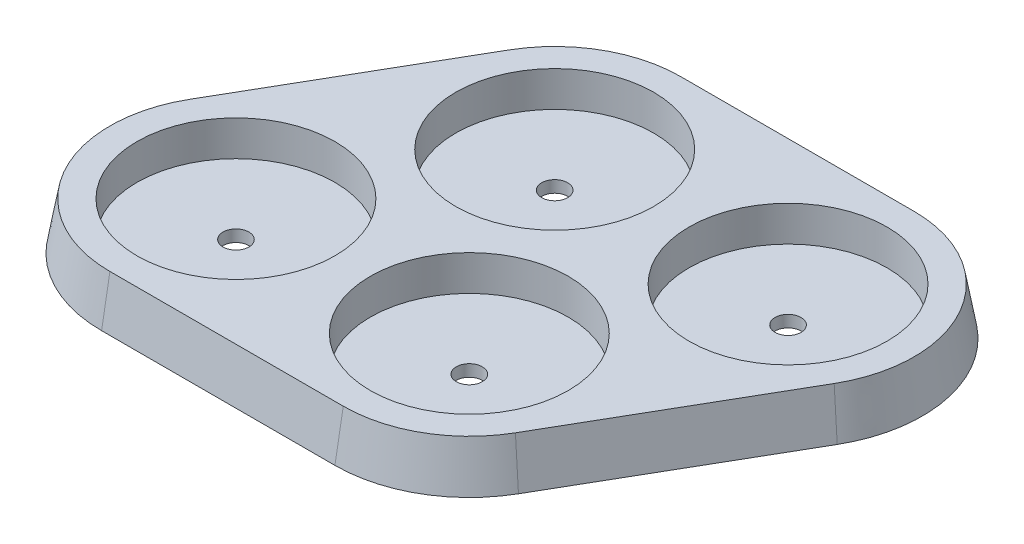
ISO-10303-21;
HEADER;
FILE_DESCRIPTION(('STEP AP214'),'2;1');
FILE_NAME('part.step','',(''),(''),'','','');
FILE_SCHEMA(('AUTOMOTIVE_DESIGN { 1 0 10303 214 1 1 1 1 }'));
ENDSEC;
DATA;
#1=APPLICATION_CONTEXT('core data for automotive mechanical design processes');
#2=APPLICATION_PROTOCOL_DEFINITION('international standard','automotive_design',2000,#1);
#3=PRODUCT_CONTEXT('',#1,'mechanical');
#4=PRODUCT('Part','Part','',(#3));
#5=PRODUCT_RELATED_PRODUCT_CATEGORY('part','',(#4));
#6=PRODUCT_DEFINITION_FORMATION('','',#4);
#7=PRODUCT_DEFINITION_CONTEXT('part definition',#1,'design');
#8=PRODUCT_DEFINITION('design','',#6,#7);
#9=PRODUCT_DEFINITION_SHAPE('','',#8);
#10=(LENGTH_UNIT() NAMED_UNIT(*) SI_UNIT(.MILLI.,.METRE.));
#11=(NAMED_UNIT(*) PLANE_ANGLE_UNIT() SI_UNIT($,.RADIAN.));
#12=(NAMED_UNIT(*) SI_UNIT($,.STERADIAN.) SOLID_ANGLE_UNIT());
#13=UNCERTAINTY_MEASURE_WITH_UNIT(LENGTH_MEASURE(1.E-05),#10,'distance_accuracy_value','');
#14=(GEOMETRIC_REPRESENTATION_CONTEXT(3) GLOBAL_UNCERTAINTY_ASSIGNED_CONTEXT((#13)) GLOBAL_UNIT_ASSIGNED_CONTEXT((#10,
#11,#12)) REPRESENTATION_CONTEXT('',''));
#15=CARTESIAN_POINT('',(0.,0.,0.));
#16=DIRECTION('',(0.,0.,1.));
#17=DIRECTION('',(1.,0.,0.));
#18=AXIS2_PLACEMENT_3D('',#15,#16,#17);
#19=CARTESIAN_POINT('',(-9.90000000000008,0.,17.1473029949318));
#20=DIRECTION('',(0.,1.,0.));
#21=DIRECTION('',(0.,0.,1.));
#22=AXIS2_PLACEMENT_3D('',#19,#20,#21);
#23=CYLINDRICAL_SURFACE('',#22,1.1);
#24=CARTESIAN_POINT('',(-9.90000000000008,0.,17.1473029949318));
#25=DIRECTION('',(0.,1.,0.));
#26=DIRECTION('',(0.,0.,1.));
#27=AXIS2_PLACEMENT_3D('',#24,#25,#26);
#28=CIRCLE('',#27,1.1);
#29=CARTESIAN_POINT('',(-9.90000000000008,0.,18.2473029949318));
#30=VERTEX_POINT('',#29);
#31=EDGE_CURVE('E154',#30,#30,#28,.T.);
#32=ORIENTED_EDGE('',*,*,#31,.F.);
#33=EDGE_LOOP('',(#32));
#34=FACE_BOUND('',#33,.T.);
#35=CARTESIAN_POINT('',(-9.90000000000008,1.,17.1473029949318));
#36=DIRECTION('',(0.,1.,0.));
#37=DIRECTION('',(0.,0.,1.));
#38=AXIS2_PLACEMENT_3D('',#35,#36,#37);
#39=CIRCLE('',#38,1.1);
#40=CARTESIAN_POINT('',(-9.90000000000008,1.,18.2473029949318));
#41=VERTEX_POINT('',#40);
#42=EDGE_CURVE('E510',#41,#41,#39,.T.);
#43=ORIENTED_EDGE('',*,*,#42,.T.);
#44=EDGE_LOOP('',(#43));
#45=FACE_BOUND('',#44,.T.);
#46=ADVANCED_FACE('F65',(#34,#45),#23,.F.);
#47=CARTESIAN_POINT('',(-19.7999999999998,0.,0.));
#48=DIRECTION('',(0.,1.,0.));
#49=DIRECTION('',(0.,0.,1.));
#50=AXIS2_PLACEMENT_3D('',#47,#48,#49);
#51=CYLINDRICAL_SURFACE('',#50,1.10000000000001);
#52=CARTESIAN_POINT('',(-19.7999999999998,0.,0.));
#53=DIRECTION('',(0.,1.,0.));
#54=DIRECTION('',(0.,0.,1.));
#55=AXIS2_PLACEMENT_3D('',#52,#53,#54);
#56=CIRCLE('',#55,1.10000000000001);
#57=CARTESIAN_POINT('',(-19.7999999999998,0.,1.10000000000001));
#58=VERTEX_POINT('',#57);
#59=EDGE_CURVE('E529',#58,#58,#56,.T.);
#60=ORIENTED_EDGE('',*,*,#59,.F.);
#61=EDGE_LOOP('',(#60));
#62=FACE_BOUND('',#61,.T.);
#63=CARTESIAN_POINT('',(-19.7999999999998,1.,0.));
#64=DIRECTION('',(0.,1.,0.));
#65=DIRECTION('',(0.,0.,1.));
#66=AXIS2_PLACEMENT_3D('',#63,#64,#65);
#67=CIRCLE('',#66,1.10000000000001);
#68=CARTESIAN_POINT('',(-19.7999999999998,1.,1.10000000000001));
#69=VERTEX_POINT('',#68);
#70=EDGE_CURVE('E519',#69,#69,#67,.T.);
#71=ORIENTED_EDGE('',*,*,#70,.T.);
#72=EDGE_LOOP('',(#71));
#73=FACE_BOUND('',#72,.T.);
#74=ADVANCED_FACE('F252',(#62,#73),#51,.F.);
#75=CARTESIAN_POINT('',(-29.6999999999999,0.,17.1473029949318));
#76=DIRECTION('',(0.,1.,0.));
#77=DIRECTION('',(0.,0.,1.));
#78=AXIS2_PLACEMENT_3D('',#75,#76,#77);
#79=CYLINDRICAL_SURFACE('',#78,1.1);
#80=CARTESIAN_POINT('',(-29.6999999999999,0.,17.1473029949318));
#81=DIRECTION('',(0.,1.,0.));
#82=DIRECTION('',(0.,0.,1.));
#83=AXIS2_PLACEMENT_3D('',#80,#81,#82);
#84=CIRCLE('',#83,1.1);
#85=CARTESIAN_POINT('',(-29.6999999999999,0.,18.2473029949319));
#86=VERTEX_POINT('',#85);
#87=EDGE_CURVE('E536',#86,#86,#84,.T.);
#88=ORIENTED_EDGE('',*,*,#87,.F.);
#89=EDGE_LOOP('',(#88));
#90=FACE_BOUND('',#89,.T.);
#91=CARTESIAN_POINT('',(-29.6999999999999,1.,17.1473029949318));
#92=DIRECTION('',(0.,1.,0.));
#93=DIRECTION('',(0.,0.,1.));
#94=AXIS2_PLACEMENT_3D('',#91,#92,#93);
#95=CIRCLE('',#94,1.1);
#96=CARTESIAN_POINT('',(-29.6999999999999,1.,18.2473029949319));
#97=VERTEX_POINT('',#96);
#98=EDGE_CURVE('E512',#97,#97,#95,.T.);
#99=ORIENTED_EDGE('',*,*,#98,.T.);
#100=EDGE_LOOP('',(#99));
#101=FACE_BOUND('',#100,.T.);
#102=ADVANCED_FACE('F258',(#90,#101),#79,.F.);
#103=CARTESIAN_POINT('',(0.,0.,0.));
#104=DIRECTION('',(0.,1.,0.));
#105=DIRECTION('',(0.,0.,1.));
#106=AXIS2_PLACEMENT_3D('',#103,#104,#105);
#107=CYLINDRICAL_SURFACE('',#106,1.1);
#108=CARTESIAN_POINT('',(0.,0.,0.));
#109=DIRECTION('',(0.,1.,0.));
#110=DIRECTION('',(0.,0.,1.));
#111=AXIS2_PLACEMENT_3D('',#108,#109,#110);
#112=CIRCLE('',#111,1.1);
#113=CARTESIAN_POINT('',(0.,0.,1.1));
#114=VERTEX_POINT('',#113);
#115=EDGE_CURVE('E158',#114,#114,#112,.T.);
#116=ORIENTED_EDGE('',*,*,#115,.F.);
#117=EDGE_LOOP('',(#116));
#118=FACE_BOUND('',#117,.T.);
#119=CARTESIAN_POINT('',(0.,1.,0.));
#120=DIRECTION('',(0.,1.,0.));
#121=DIRECTION('',(0.,0.,1.));
#122=AXIS2_PLACEMENT_3D('',#119,#120,#121);
#123=CIRCLE('',#122,1.1);
#124=CARTESIAN_POINT('',(0.,1.,1.1));
#125=VERTEX_POINT('',#124);
#126=EDGE_CURVE('E491',#125,#125,#123,.T.);
#127=ORIENTED_EDGE('',*,*,#126,.T.);
#128=EDGE_LOOP('',(#127));
#129=FACE_BOUND('',#128,.T.);
#130=ADVANCED_FACE('F275',(#118,#129),#107,.F.);
#131=CARTESIAN_POINT('',(9.87268960314258,0.,5.70000000000005));
#132=DIRECTION('',(0.852868531952441,0.173648177666931,0.492403876506108));
#133=DIRECTION('',(0.500000000000004,0.,-0.866025403784436));
#134=AXIS2_PLACEMENT_3D('',#131,#132,#133);
#135=PLANE('',#134);
#136=DIRECTION('',(-0.500000000000004,0.,0.866025403784436));
#137=VECTOR('',#136,1.);
#138=CARTESIAN_POINT('',(9.87268960314258,0.,5.70000000000005));
#139=LINE('',#138,#137);
#140=CARTESIAN_POINT('',(9.87268960314258,0.,5.70000000000005));
#141=VERTEX_POINT('',#140);
#142=CARTESIAN_POINT('',(-0.0273103968575087,0.,22.8473029949319));
#143=VERTEX_POINT('',#142);
#144=EDGE_CURVE('E145',#141,#143,#139,.T.);
#145=ORIENTED_EDGE('',*,*,#144,.F.);
#146=DIRECTION('',(0.150383733180435,-0.984807753012208,0.0868240888334661));
#147=VECTOR('',#146,1.);
#148=CARTESIAN_POINT('',(9.87268960314258,0.,5.70000000000004));
#149=LINE('',#148,#147);
#150=CARTESIAN_POINT('',(9.26187502447802,4.,5.34734603858311));
#151=VERTEX_POINT('',#150);
#152=EDGE_CURVE('E12',#151,#141,#149,.T.);
#153=ORIENTED_EDGE('',*,*,#152,.F.);
#154=DIRECTION('',(-0.500000000000004,0.,0.866025403784436));
#155=VECTOR('',#154,1.);
#156=CARTESIAN_POINT('',(9.26187502447802,4.,5.34734603858312));
#157=LINE('',#156,#155);
#158=CARTESIAN_POINT('',(-0.638124975522065,4.,22.494649033515));
#159=VERTEX_POINT('',#158);
#160=EDGE_CURVE('E182',#151,#159,#157,.T.);
#161=ORIENTED_EDGE('',*,*,#160,.T.);
#162=DIRECTION('',(0.150383733180435,-0.984807753012208,0.0868240888334661));
#163=VECTOR('',#162,1.);
#164=CARTESIAN_POINT('',(-0.0273103968575079,0.,22.8473029949319));
#165=LINE('',#164,#163);
#166=EDGE_CURVE('E151',#159,#143,#165,.T.);
#167=ORIENTED_EDGE('',*,*,#166,.T.);
#168=EDGE_LOOP('',(#145,#153,#161,#167));
#169=FACE_BOUND('',#168,.T.);
#170=ADVANCED_FACE('F150',(#169),#135,.T.);
#171=CARTESIAN_POINT('',(0.,0.,0.));
#172=DIRECTION('',(0.,-1.,0.));
#173=DIRECTION('',(0.,0.,1.));
#174=AXIS2_PLACEMENT_3D('',#171,#172,#173);
#175=CONICAL_SURFACE('',#174,11.4,0.174532925199433);
#176=CARTESIAN_POINT('',(0.,0.,0.));
#177=DIRECTION('',(0.,1.,0.));
#178=DIRECTION('',(0.,0.,1.));
#179=AXIS2_PLACEMENT_3D('',#176,#177,#178);
#180=CIRCLE('',#179,11.4);
#181=CARTESIAN_POINT('',(0.,0.,-11.4));
#182=VERTEX_POINT('',#181);
#183=EDGE_CURVE('E134',#141,#182,#180,.T.);
#184=ORIENTED_EDGE('',*,*,#183,.T.);
#185=DIRECTION('',(0.,-0.984807753012208,-0.173648177666931));
#186=VECTOR('',#185,1.);
#187=CARTESIAN_POINT('',(0.,0.,-11.4));
#188=LINE('',#187,#186);
#189=CARTESIAN_POINT('',(0.,4.,-10.6946920771661));
#190=VERTEX_POINT('',#189);
#191=EDGE_CURVE('E75',#190,#182,#188,.T.);
#192=ORIENTED_EDGE('',*,*,#191,.F.);
#193=CARTESIAN_POINT('',(0.,4.,0.));
#194=DIRECTION('',(0.,1.,0.));
#195=DIRECTION('',(0.,0.,1.));
#196=AXIS2_PLACEMENT_3D('',#193,#194,#195);
#197=CIRCLE('',#196,10.6946920771661);
#198=EDGE_CURVE('E136',#151,#190,#197,.T.);
#199=ORIENTED_EDGE('',*,*,#198,.F.);
#200=ORIENTED_EDGE('',*,*,#152,.T.);
#201=EDGE_LOOP('',(#184,#192,#199,#200));
#202=FACE_BOUND('',#201,.T.);
#203=ADVANCED_FACE('F67',(#202),#175,.T.);
#204=CARTESIAN_POINT('',(0.,0.,-11.4));
#205=DIRECTION('',(0.,0.173648177666931,-0.984807753012208));
#206=DIRECTION('',(0.,0.984807753012208,0.173648177666931));
#207=AXIS2_PLACEMENT_3D('',#204,#205,#206);
#208=PLANE('',#207);
#209=DIRECTION('',(-1.,0.,0.));
#210=VECTOR('',#209,1.);
#211=CARTESIAN_POINT('',(0.,0.,-11.4));
#212=LINE('',#211,#210);
#213=CARTESIAN_POINT('',(-19.7999999999998,0.,-11.4));
#214=VERTEX_POINT('',#213);
#215=EDGE_CURVE('E147',#182,#214,#212,.T.);
#216=ORIENTED_EDGE('',*,*,#215,.T.);
#217=DIRECTION('',(0.,-0.984807753012208,-0.173648177666931));
#218=VECTOR('',#217,1.);
#219=CARTESIAN_POINT('',(-19.7999999999998,0.,-11.4));
#220=LINE('',#219,#218);
#221=CARTESIAN_POINT('',(-19.7999999999998,4.,-10.6946920771661));
#222=VERTEX_POINT('',#221);
#223=EDGE_CURVE('E197',#222,#214,#220,.T.);
#224=ORIENTED_EDGE('',*,*,#223,.F.);
#225=DIRECTION('',(1.,0.,0.));
#226=VECTOR('',#225,1.);
#227=CARTESIAN_POINT('',(0.,4.,-10.6946920771661));
#228=LINE('',#227,#226);
#229=EDGE_CURVE('E207',#190,#222,#228,.F.);
#230=ORIENTED_EDGE('',*,*,#229,.F.);
#231=ORIENTED_EDGE('',*,*,#191,.T.);
#232=EDGE_LOOP('',(#216,#224,#230,#231));
#233=FACE_BOUND('',#232,.T.);
#234=ADVANCED_FACE('F236',(#233),#208,.T.);
#235=CARTESIAN_POINT('',(-19.7999999999998,0.,0.));
#236=DIRECTION('',(0.,-1.,0.));
#237=DIRECTION('',(0.,0.,1.));
#238=AXIS2_PLACEMENT_3D('',#235,#236,#237);
#239=CONICAL_SURFACE('',#238,11.4,0.174532925199433);
#240=CARTESIAN_POINT('',(-19.7999999999998,0.,0.));
#241=DIRECTION('',(0.,1.,0.));
#242=DIRECTION('',(0.,0.,1.));
#243=AXIS2_PLACEMENT_3D('',#240,#241,#242);
#244=CIRCLE('',#243,11.4);
#245=CARTESIAN_POINT('',(-29.6726896031424,0.,-5.70000000000005));
#246=VERTEX_POINT('',#245);
#247=EDGE_CURVE('E164',#214,#246,#244,.T.);
#248=ORIENTED_EDGE('',*,*,#247,.T.);
#249=DIRECTION('',(-0.150383733180435,-0.984807753012208,-0.0868240888334661));
#250=VECTOR('',#249,1.);
#251=CARTESIAN_POINT('',(-29.6726896031424,0.,-5.70000000000005));
#252=LINE('',#251,#250);
#253=CARTESIAN_POINT('',(-29.0618750244779,4.,-5.34734603858311));
#254=VERTEX_POINT('',#253);
#255=EDGE_CURVE('E194',#254,#246,#252,.T.);
#256=ORIENTED_EDGE('',*,*,#255,.F.);
#257=CARTESIAN_POINT('',(-19.7999999999998,4.,0.));
#258=DIRECTION('',(0.,1.,0.));
#259=DIRECTION('',(0.,0.,1.));
#260=AXIS2_PLACEMENT_3D('',#257,#258,#259);
#261=CIRCLE('',#260,10.6946920771661);
#262=EDGE_CURVE('E210',#222,#254,#261,.T.);
#263=ORIENTED_EDGE('',*,*,#262,.F.);
#264=ORIENTED_EDGE('',*,*,#223,.T.);
#265=EDGE_LOOP('',(#248,#256,#263,#264));
#266=FACE_BOUND('',#265,.T.);
#267=ADVANCED_FACE('F240',(#266),#239,.T.);
#268=CARTESIAN_POINT('',(-24.7226896031424,0.,-14.273651497466));
#269=DIRECTION('',(-0.852868531952441,0.173648177666931,-0.492403876506108));
#270=DIRECTION('',(-0.500000000000004,0.,0.866025403784436));
#271=AXIS2_PLACEMENT_3D('',#268,#269,#270);
#272=PLANE('',#271);
#273=DIRECTION('',(0.500000000000004,0.,-0.866025403784436));
#274=VECTOR('',#273,1.);
#275=CARTESIAN_POINT('',(-24.7226896031424,0.,-14.273651497466));
#276=LINE('',#275,#274);
#277=CARTESIAN_POINT('',(-39.5726896031425,0.,11.4473029949318));
#278=VERTEX_POINT('',#277);
#279=EDGE_CURVE('E168',#278,#246,#276,.T.);
#280=ORIENTED_EDGE('',*,*,#279,.F.);
#281=DIRECTION('',(-0.150383733180435,-0.984807753012208,-0.0868240888334661));
#282=VECTOR('',#281,1.);
#283=CARTESIAN_POINT('',(-39.5726896031425,0.,11.4473029949318));
#284=LINE('',#283,#282);
#285=CARTESIAN_POINT('',(-38.961875024478,4.,11.7999569563487));
#286=VERTEX_POINT('',#285);
#287=EDGE_CURVE('E191',#286,#278,#284,.T.);
#288=ORIENTED_EDGE('',*,*,#287,.F.);
#289=DIRECTION('',(0.500000000000004,0.,-0.866025403784436));
#290=VECTOR('',#289,1.);
#291=CARTESIAN_POINT('',(-24.1118750244778,4.,-13.920997536049));
#292=LINE('',#291,#290);
#293=EDGE_CURVE('E213',#286,#254,#292,.T.);
#294=ORIENTED_EDGE('',*,*,#293,.T.);
#295=ORIENTED_EDGE('',*,*,#255,.T.);
#296=EDGE_LOOP('',(#280,#288,#294,#295));
#297=FACE_BOUND('',#296,.T.);
#298=ADVANCED_FACE('F242',(#297),#272,.T.);
#299=CARTESIAN_POINT('',(-29.6999999999999,0.,17.1473029949318));
#300=DIRECTION('',(0.,-1.,0.));
#301=DIRECTION('',(0.,0.,1.));
#302=AXIS2_PLACEMENT_3D('',#299,#300,#301);
#303=CONICAL_SURFACE('',#302,11.4,0.174532925199433);
#304=CARTESIAN_POINT('',(-29.6999999999999,0.,17.1473029949318));
#305=DIRECTION('',(0.,1.,0.));
#306=DIRECTION('',(0.,0.,1.));
#307=AXIS2_PLACEMENT_3D('',#304,#305,#306);
#308=CIRCLE('',#307,11.4);
#309=CARTESIAN_POINT('',(-29.6999999999999,0.,28.5473029949318));
#310=VERTEX_POINT('',#309);
#311=EDGE_CURVE('E172',#278,#310,#308,.T.);
#312=ORIENTED_EDGE('',*,*,#311,.T.);
#313=DIRECTION('',(0.,-0.984807753012208,0.173648177666931));
#314=VECTOR('',#313,1.);
#315=CARTESIAN_POINT('',(-29.6999999999999,0.,28.5473029949318));
#316=LINE('',#315,#314);
#317=CARTESIAN_POINT('',(-29.6999999999999,4.,27.841995072098));
#318=VERTEX_POINT('',#317);
#319=EDGE_CURVE('E188',#318,#310,#316,.T.);
#320=ORIENTED_EDGE('',*,*,#319,.F.);
#321=CARTESIAN_POINT('',(-29.6999999999999,4.,17.1473029949318));
#322=DIRECTION('',(0.,1.,0.));
#323=DIRECTION('',(0.,0.,1.));
#324=AXIS2_PLACEMENT_3D('',#321,#322,#323);
#325=CIRCLE('',#324,10.6946920771661);
#326=EDGE_CURVE('E217',#286,#318,#325,.T.);
#327=ORIENTED_EDGE('',*,*,#326,.F.);
#328=ORIENTED_EDGE('',*,*,#287,.T.);
#329=EDGE_LOOP('',(#312,#320,#327,#328));
#330=FACE_BOUND('',#329,.T.);
#331=ADVANCED_FACE('F228',(#330),#303,.T.);
#332=CARTESIAN_POINT('',(0.,0.,28.5473029949318));
#333=DIRECTION('',(0.,0.173648177666931,0.984807753012208));
#334=DIRECTION('',(0.,-0.984807753012208,0.173648177666931));
#335=AXIS2_PLACEMENT_3D('',#332,#333,#334);
#336=PLANE('',#335);
#337=DIRECTION('',(-1.,0.,0.));
#338=VECTOR('',#337,1.);
#339=CARTESIAN_POINT('',(0.,0.,28.5473029949318));
#340=LINE('',#339,#338);
#341=CARTESIAN_POINT('',(-9.90000000000008,0.,28.5473029949318));
#342=VERTEX_POINT('',#341);
#343=EDGE_CURVE('E176',#342,#310,#340,.T.);
#344=ORIENTED_EDGE('',*,*,#343,.F.);
#345=DIRECTION('',(0.,-0.984807753012208,0.173648177666931));
#346=VECTOR('',#345,1.);
#347=CARTESIAN_POINT('',(-9.90000000000008,0.,28.5473029949318));
#348=LINE('',#347,#346);
#349=CARTESIAN_POINT('',(-9.90000000000008,4.,27.841995072098));
#350=VERTEX_POINT('',#349);
#351=EDGE_CURVE('E90',#350,#342,#348,.T.);
#352=ORIENTED_EDGE('',*,*,#351,.F.);
#353=DIRECTION('',(-1.,0.,0.));
#354=VECTOR('',#353,1.);
#355=CARTESIAN_POINT('',(0.,4.,27.841995072098));
#356=LINE('',#355,#354);
#357=EDGE_CURVE('E219',#350,#318,#356,.T.);
#358=ORIENTED_EDGE('',*,*,#357,.T.);
#359=ORIENTED_EDGE('',*,*,#319,.T.);
#360=EDGE_LOOP('',(#344,#352,#358,#359));
#361=FACE_BOUND('',#360,.T.);
#362=ADVANCED_FACE('F222',(#361),#336,.T.);
#363=CARTESIAN_POINT('',(-9.90000000000008,0.,17.1473029949318));
#364=DIRECTION('',(0.,-1.,0.));
#365=DIRECTION('',(0.,0.,1.));
#366=AXIS2_PLACEMENT_3D('',#363,#364,#365);
#367=CONICAL_SURFACE('',#366,11.4,0.174532925199433);
#368=CARTESIAN_POINT('',(-9.90000000000008,0.,17.1473029949318));
#369=DIRECTION('',(0.,1.,0.));
#370=DIRECTION('',(0.,0.,1.));
#371=AXIS2_PLACEMENT_3D('',#368,#369,#370);
#372=CIRCLE('',#371,11.4);
#373=EDGE_CURVE('E180',#342,#143,#372,.T.);
#374=ORIENTED_EDGE('',*,*,#373,.T.);
#375=ORIENTED_EDGE('',*,*,#166,.F.);
#376=CARTESIAN_POINT('',(-9.90000000000008,4.,17.1473029949318));
#377=DIRECTION('',(0.,1.,0.));
#378=DIRECTION('',(0.,0.,1.));
#379=AXIS2_PLACEMENT_3D('',#376,#377,#378);
#380=CIRCLE('',#379,10.6946920771661);
#381=EDGE_CURVE('E69',#350,#159,#380,.T.);
#382=ORIENTED_EDGE('',*,*,#381,.F.);
#383=ORIENTED_EDGE('',*,*,#351,.T.);
#384=EDGE_LOOP('',(#374,#375,#382,#383));
#385=FACE_BOUND('',#384,.T.);
#386=ADVANCED_FACE('F232',(#385),#367,.T.);
#387=CARTESIAN_POINT('',(0.,4.,0.));
#388=DIRECTION('',(0.,1.,0.));
#389=DIRECTION('',(0.,0.,1.));
#390=AXIS2_PLACEMENT_3D('',#387,#388,#389);
#391=PLANE('',#390);
#392=CARTESIAN_POINT('',(-29.6999999999999,4.,17.1473029949318));
#393=DIRECTION('',(0.,1.,0.));
#394=DIRECTION('',(0.,0.,1.));
#395=AXIS2_PLACEMENT_3D('',#392,#393,#394);
#396=CIRCLE('',#395,8.4);
#397=CARTESIAN_POINT('',(-29.6999999999999,4.,25.5473029949319));
#398=VERTEX_POINT('',#397);
#399=EDGE_CURVE('E502',#398,#398,#396,.T.);
#400=ORIENTED_EDGE('',*,*,#399,.F.);
#401=EDGE_LOOP('',(#400));
#402=FACE_BOUND('',#401,.T.);
#403=CARTESIAN_POINT('',(0.,4.,0.));
#404=DIRECTION('',(0.,1.,0.));
#405=DIRECTION('',(0.,0.,1.));
#406=AXIS2_PLACEMENT_3D('',#403,#404,#405);
#407=CIRCLE('',#406,8.4);
#408=CARTESIAN_POINT('',(0.,4.,8.4));
#409=VERTEX_POINT('',#408);
#410=EDGE_CURVE('E493',#409,#409,#407,.T.);
#411=ORIENTED_EDGE('',*,*,#410,.F.);
#412=EDGE_LOOP('',(#411));
#413=FACE_BOUND('',#412,.T.);
#414=CARTESIAN_POINT('',(-9.90000000000008,4.,17.1473029949318));
#415=DIRECTION('',(0.,1.,0.));
#416=DIRECTION('',(0.,0.,1.));
#417=AXIS2_PLACEMENT_3D('',#414,#415,#416);
#418=CIRCLE('',#417,8.4);
#419=CARTESIAN_POINT('',(-9.90000000000008,4.,25.5473029949318));
#420=VERTEX_POINT('',#419);
#421=EDGE_CURVE('E506',#420,#420,#418,.T.);
#422=ORIENTED_EDGE('',*,*,#421,.F.);
#423=EDGE_LOOP('',(#422));
#424=FACE_BOUND('',#423,.T.);
#425=CARTESIAN_POINT('',(-19.7999999999998,4.,0.));
#426=DIRECTION('',(0.,1.,0.));
#427=DIRECTION('',(0.,0.,1.));
#428=AXIS2_PLACEMENT_3D('',#425,#426,#427);
#429=CIRCLE('',#428,8.40000000000001);
#430=CARTESIAN_POINT('',(-19.7999999999998,4.,8.40000000000001));
#431=VERTEX_POINT('',#430);
#432=EDGE_CURVE('E523',#431,#431,#429,.T.);
#433=ORIENTED_EDGE('',*,*,#432,.F.);
#434=EDGE_LOOP('',(#433));
#435=FACE_BOUND('',#434,.T.);
#436=ORIENTED_EDGE('',*,*,#160,.F.);
#437=ORIENTED_EDGE('',*,*,#198,.T.);
#438=ORIENTED_EDGE('',*,*,#229,.T.);
#439=ORIENTED_EDGE('',*,*,#262,.T.);
#440=ORIENTED_EDGE('',*,*,#293,.F.);
#441=ORIENTED_EDGE('',*,*,#326,.T.);
#442=ORIENTED_EDGE('',*,*,#357,.F.);
#443=ORIENTED_EDGE('',*,*,#381,.T.);
#444=EDGE_LOOP('',(#436,#437,#438,#439,#440,#441,#442,#443));
#445=FACE_BOUND('',#444,.T.);
#446=ADVANCED_FACE('F224',(#402,#413,#424,#435,#445),#391,.T.);
#447=CARTESIAN_POINT('',(0.,0.,0.));
#448=DIRECTION('',(0.,1.,0.));
#449=DIRECTION('',(0.,0.,1.));
#450=AXIS2_PLACEMENT_3D('',#447,#448,#449);
#451=PLANE('',#450);
#452=ORIENTED_EDGE('',*,*,#115,.T.);
#453=EDGE_LOOP('',(#452));
#454=FACE_BOUND('',#453,.T.);
#455=ORIENTED_EDGE('',*,*,#87,.T.);
#456=EDGE_LOOP('',(#455));
#457=FACE_BOUND('',#456,.T.);
#458=ORIENTED_EDGE('',*,*,#59,.T.);
#459=EDGE_LOOP('',(#458));
#460=FACE_BOUND('',#459,.T.);
#461=ORIENTED_EDGE('',*,*,#31,.T.);
#462=EDGE_LOOP('',(#461));
#463=FACE_BOUND('',#462,.T.);
#464=ORIENTED_EDGE('',*,*,#144,.T.);
#465=ORIENTED_EDGE('',*,*,#373,.F.);
#466=ORIENTED_EDGE('',*,*,#343,.T.);
#467=ORIENTED_EDGE('',*,*,#311,.F.);
#468=ORIENTED_EDGE('',*,*,#279,.T.);
#469=ORIENTED_EDGE('',*,*,#247,.F.);
#470=ORIENTED_EDGE('',*,*,#215,.F.);
#471=ORIENTED_EDGE('',*,*,#183,.F.);
#472=EDGE_LOOP('',(#464,#465,#466,#467,#468,#469,#470,#471));
#473=FACE_BOUND('',#472,.T.);
#474=ADVANCED_FACE('F143',(#454,#457,#460,#463,#473),#451,.F.);
#475=CARTESIAN_POINT('',(0.,1.,0.));
#476=DIRECTION('',(0.,1.,0.));
#477=DIRECTION('',(0.,0.,1.));
#478=AXIS2_PLACEMENT_3D('',#475,#476,#477);
#479=CYLINDRICAL_SURFACE('',#478,8.4);
#480=CARTESIAN_POINT('',(0.,1.,0.));
#481=DIRECTION('',(0.,1.,0.));
#482=DIRECTION('',(0.,0.,1.));
#483=AXIS2_PLACEMENT_3D('',#480,#481,#482);
#484=CIRCLE('',#483,8.4);
#485=CARTESIAN_POINT('',(0.,1.,8.4));
#486=VERTEX_POINT('',#485);
#487=EDGE_CURVE('E499',#486,#486,#484,.T.);
#488=ORIENTED_EDGE('',*,*,#487,.F.);
#489=EDGE_LOOP('',(#488));
#490=FACE_BOUND('',#489,.T.);
#491=ORIENTED_EDGE('',*,*,#410,.T.);
#492=EDGE_LOOP('',(#491));
#493=FACE_BOUND('',#492,.T.);
#494=ADVANCED_FACE('F271',(#490,#493),#479,.F.);
#495=CARTESIAN_POINT('',(0.,1.,0.));
#496=DIRECTION('',(0.,1.,0.));
#497=DIRECTION('',(0.,0.,1.));
#498=AXIS2_PLACEMENT_3D('',#495,#496,#497);
#499=PLANE('',#498);
#500=ORIENTED_EDGE('',*,*,#126,.F.);
#501=EDGE_LOOP('',(#500));
#502=FACE_BOUND('',#501,.T.);
#503=ORIENTED_EDGE('',*,*,#487,.T.);
#504=EDGE_LOOP('',(#503));
#505=FACE_BOUND('',#504,.T.);
#506=ADVANCED_FACE('F302',(#502,#505),#499,.T.);
#507=CARTESIAN_POINT('',(-29.6999999999999,1.,17.1473029949318));
#508=DIRECTION('',(0.,1.,0.));
#509=DIRECTION('',(0.,0.,1.));
#510=AXIS2_PLACEMENT_3D('',#507,#508,#509);
#511=CYLINDRICAL_SURFACE('',#510,8.4);
#512=CARTESIAN_POINT('',(-29.6999999999999,1.,17.1473029949318));
#513=DIRECTION('',(0.,1.,0.));
#514=DIRECTION('',(0.,0.,1.));
#515=AXIS2_PLACEMENT_3D('',#512,#513,#514);
#516=CIRCLE('',#515,8.4);
#517=CARTESIAN_POINT('',(-29.6999999999999,1.,25.5473029949319));
#518=VERTEX_POINT('',#517);
#519=EDGE_CURVE('E494',#518,#518,#516,.T.);
#520=ORIENTED_EDGE('',*,*,#519,.F.);
#521=EDGE_LOOP('',(#520));
#522=FACE_BOUND('',#521,.T.);
#523=ORIENTED_EDGE('',*,*,#399,.T.);
#524=EDGE_LOOP('',(#523));
#525=FACE_BOUND('',#524,.T.);
#526=ADVANCED_FACE('F310',(#522,#525),#511,.F.);
#527=CARTESIAN_POINT('',(-29.6999999999999,1.,17.1473029949318));
#528=DIRECTION('',(0.,1.,0.));
#529=DIRECTION('',(0.,0.,1.));
#530=AXIS2_PLACEMENT_3D('',#527,#528,#529);
#531=PLANE('',#530);
#532=ORIENTED_EDGE('',*,*,#98,.F.);
#533=EDGE_LOOP('',(#532));
#534=FACE_BOUND('',#533,.T.);
#535=ORIENTED_EDGE('',*,*,#519,.T.);
#536=EDGE_LOOP('',(#535));
#537=FACE_BOUND('',#536,.T.);
#538=ADVANCED_FACE('F318',(#534,#537),#531,.T.);
#539=CARTESIAN_POINT('',(-19.7999999999998,1.,0.));
#540=DIRECTION('',(0.,1.,0.));
#541=DIRECTION('',(0.,0.,1.));
#542=AXIS2_PLACEMENT_3D('',#539,#540,#541);
#543=CYLINDRICAL_SURFACE('',#542,8.40000000000001);
#544=CARTESIAN_POINT('',(-19.7999999999998,1.,0.));
#545=DIRECTION('',(0.,1.,0.));
#546=DIRECTION('',(0.,0.,1.));
#547=AXIS2_PLACEMENT_3D('',#544,#545,#546);
#548=CIRCLE('',#547,8.40000000000001);
#549=CARTESIAN_POINT('',(-19.7999999999998,1.,8.40000000000001));
#550=VERTEX_POINT('',#549);
#551=EDGE_CURVE('E525',#550,#550,#548,.T.);
#552=ORIENTED_EDGE('',*,*,#551,.F.);
#553=EDGE_LOOP('',(#552));
#554=FACE_BOUND('',#553,.T.);
#555=ORIENTED_EDGE('',*,*,#432,.T.);
#556=EDGE_LOOP('',(#555));
#557=FACE_BOUND('',#556,.T.);
#558=ADVANCED_FACE('F326',(#554,#557),#543,.F.);
#559=CARTESIAN_POINT('',(-19.7999999999998,1.,0.));
#560=DIRECTION('',(0.,1.,0.));
#561=DIRECTION('',(0.,0.,1.));
#562=AXIS2_PLACEMENT_3D('',#559,#560,#561);
#563=PLANE('',#562);
#564=ORIENTED_EDGE('',*,*,#70,.F.);
#565=EDGE_LOOP('',(#564));
#566=FACE_BOUND('',#565,.T.);
#567=ORIENTED_EDGE('',*,*,#551,.T.);
#568=EDGE_LOOP('',(#567));
#569=FACE_BOUND('',#568,.T.);
#570=ADVANCED_FACE('F334',(#566,#569),#563,.T.);
#571=CARTESIAN_POINT('',(-9.90000000000008,1.,17.1473029949318));
#572=DIRECTION('',(0.,1.,0.));
#573=DIRECTION('',(0.,0.,1.));
#574=AXIS2_PLACEMENT_3D('',#571,#572,#573);
#575=CYLINDRICAL_SURFACE('',#574,8.4);
#576=CARTESIAN_POINT('',(-9.90000000000008,1.,17.1473029949318));
#577=DIRECTION('',(0.,1.,0.));
#578=DIRECTION('',(0.,0.,1.));
#579=AXIS2_PLACEMENT_3D('',#576,#577,#578);
#580=CIRCLE('',#579,8.4);
#581=CARTESIAN_POINT('',(-9.90000000000008,1.,25.5473029949318));
#582=VERTEX_POINT('',#581);
#583=EDGE_CURVE('E524',#582,#582,#580,.T.);
#584=ORIENTED_EDGE('',*,*,#583,.F.);
#585=EDGE_LOOP('',(#584));
#586=FACE_BOUND('',#585,.T.);
#587=ORIENTED_EDGE('',*,*,#421,.T.);
#588=EDGE_LOOP('',(#587));
#589=FACE_BOUND('',#588,.T.);
#590=ADVANCED_FACE('F342',(#586,#589),#575,.F.);
#591=CARTESIAN_POINT('',(-9.90000000000008,1.,17.1473029949318));
#592=DIRECTION('',(0.,1.,0.));
#593=DIRECTION('',(0.,0.,1.));
#594=AXIS2_PLACEMENT_3D('',#591,#592,#593);
#595=PLANE('',#594);
#596=ORIENTED_EDGE('',*,*,#42,.F.);
#597=EDGE_LOOP('',(#596));
#598=FACE_BOUND('',#597,.T.);
#599=ORIENTED_EDGE('',*,*,#583,.T.);
#600=EDGE_LOOP('',(#599));
#601=FACE_BOUND('',#600,.T.);
#602=ADVANCED_FACE('F350',(#598,#601),#595,.T.);
#603=CLOSED_SHELL('',(#46,#74,#102,#130,#170,#203,#234,#267,#298,#331,#362,#386,#446,#474,#494,
#506,#526,#538,#558,#570,#590,#602));
#604=MANIFOLD_SOLID_BREP('B2',#603);
#605=ADVANCED_BREP_SHAPE_REPRESENTATION('',(#18,#604),#14);
#606=SHAPE_DEFINITION_REPRESENTATION(#9,#605);
ENDSEC;
END-ISO-10303-21;
